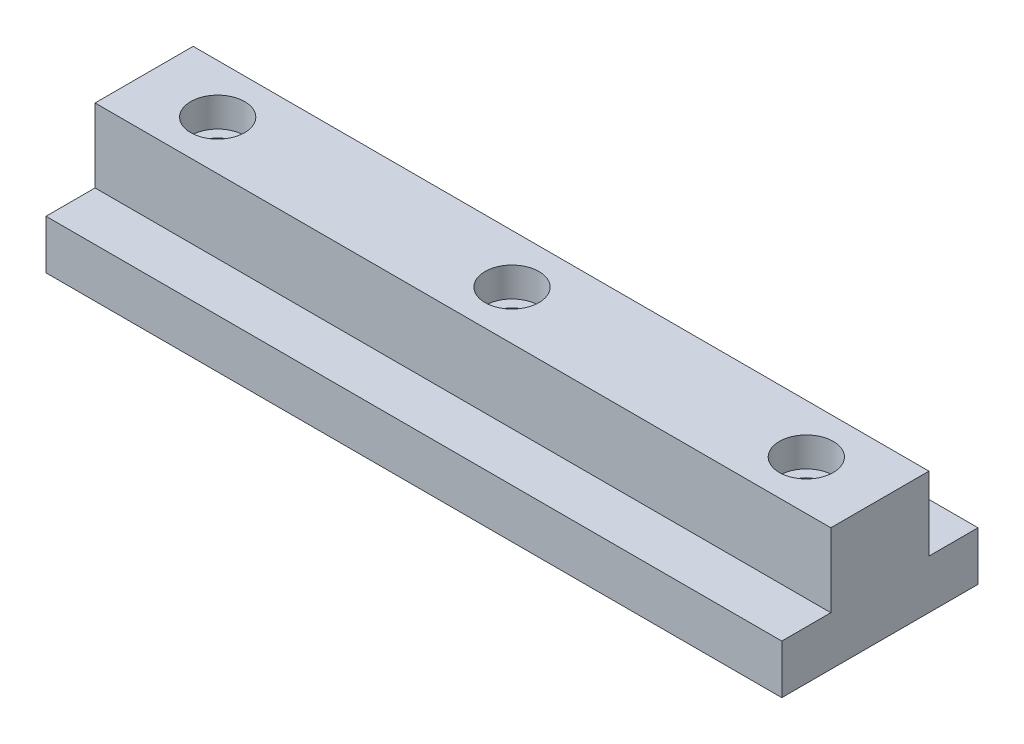
ISO-10303-21;
HEADER;
FILE_DESCRIPTION(('STEP AP214'),'2;1');
FILE_NAME('part.step','',(''),(''),'','','');
FILE_SCHEMA(('AUTOMOTIVE_DESIGN { 1 0 10303 214 1 1 1 1 }'));
ENDSEC;
DATA;
#1=APPLICATION_CONTEXT('core data for automotive mechanical design processes');
#2=APPLICATION_PROTOCOL_DEFINITION('international standard','automotive_design',2000,#1);
#3=PRODUCT_CONTEXT('',#1,'mechanical');
#4=PRODUCT('Part','Part','',(#3));
#5=PRODUCT_RELATED_PRODUCT_CATEGORY('part','',(#4));
#6=PRODUCT_DEFINITION_FORMATION('','',#4);
#7=PRODUCT_DEFINITION_CONTEXT('part definition',#1,'design');
#8=PRODUCT_DEFINITION('design','',#6,#7);
#9=PRODUCT_DEFINITION_SHAPE('','',#8);
#10=(LENGTH_UNIT() NAMED_UNIT(*) SI_UNIT(.MILLI.,.METRE.));
#11=(NAMED_UNIT(*) PLANE_ANGLE_UNIT() SI_UNIT($,.RADIAN.));
#12=(NAMED_UNIT(*) SI_UNIT($,.STERADIAN.) SOLID_ANGLE_UNIT());
#13=UNCERTAINTY_MEASURE_WITH_UNIT(LENGTH_MEASURE(1.E-05),#10,'distance_accuracy_value','');
#14=(GEOMETRIC_REPRESENTATION_CONTEXT(3) GLOBAL_UNCERTAINTY_ASSIGNED_CONTEXT((#13)) GLOBAL_UNIT_ASSIGNED_CONTEXT((#10,
#11,#12)) REPRESENTATION_CONTEXT('',''));
#15=CARTESIAN_POINT('',(0.,0.,0.));
#16=DIRECTION('',(0.,0.,1.));
#17=DIRECTION('',(1.,0.,0.));
#18=AXIS2_PLACEMENT_3D('',#15,#16,#17);
#19=CARTESIAN_POINT('',(75.,10.,-20.));
#20=DIRECTION('',(0.,0.,1.));
#21=DIRECTION('',(1.,0.,0.));
#22=AXIS2_PLACEMENT_3D('',#19,#20,#21);
#23=PLANE('',#22);
#24=DIRECTION('',(0.,1.,0.));
#25=VECTOR('',#24,1.);
#26=CARTESIAN_POINT('',(-75.,10.,-20.));
#27=LINE('',#26,#25);
#28=CARTESIAN_POINT('',(-75.,0.,-20.));
#29=VERTEX_POINT('',#28);
#30=CARTESIAN_POINT('',(-75.,10.,-20.));
#31=VERTEX_POINT('',#30);
#32=EDGE_CURVE('E157',#29,#31,#27,.T.);
#33=ORIENTED_EDGE('',*,*,#32,.T.);
#34=DIRECTION('',(-1.,0.,0.));
#35=VECTOR('',#34,1.);
#36=CARTESIAN_POINT('',(75.,10.,-20.));
#37=LINE('',#36,#35);
#38=CARTESIAN_POINT('',(75.,10.,-20.));
#39=VERTEX_POINT('',#38);
#40=EDGE_CURVE('E11',#39,#31,#37,.T.);
#41=ORIENTED_EDGE('',*,*,#40,.F.);
#42=DIRECTION('',(0.,1.,0.));
#43=VECTOR('',#42,1.);
#44=CARTESIAN_POINT('',(75.,10.,-20.));
#45=LINE('',#44,#43);
#46=CARTESIAN_POINT('',(75.,0.,-20.));
#47=VERTEX_POINT('',#46);
#48=EDGE_CURVE('E179',#47,#39,#45,.T.);
#49=ORIENTED_EDGE('',*,*,#48,.F.);
#50=DIRECTION('',(-1.,0.,0.));
#51=VECTOR('',#50,1.);
#52=CARTESIAN_POINT('',(75.,0.,-20.));
#53=LINE('',#52,#51);
#54=EDGE_CURVE('E153',#47,#29,#53,.T.);
#55=ORIENTED_EDGE('',*,*,#54,.T.);
#56=EDGE_LOOP('',(#33,#41,#49,#55));
#57=FACE_BOUND('',#56,.T.);
#58=ADVANCED_FACE('F51',(#57),#23,.F.);
#59=CARTESIAN_POINT('',(75.,10.,-10.));
#60=DIRECTION('',(0.,-1.,0.));
#61=DIRECTION('',(0.,0.,-1.));
#62=AXIS2_PLACEMENT_3D('',#59,#60,#61);
#63=PLANE('',#62);
#64=DIRECTION('',(0.,0.,1.));
#65=VECTOR('',#64,1.);
#66=CARTESIAN_POINT('',(-75.,10.,-10.));
#67=LINE('',#66,#65);
#68=CARTESIAN_POINT('',(-75.,10.,-10.));
#69=VERTEX_POINT('',#68);
#70=EDGE_CURVE('E161',#31,#69,#67,.T.);
#71=ORIENTED_EDGE('',*,*,#70,.T.);
#72=DIRECTION('',(-1.,0.,0.));
#73=VECTOR('',#72,1.);
#74=CARTESIAN_POINT('',(75.,10.,-10.));
#75=LINE('',#74,#73);
#76=CARTESIAN_POINT('',(75.,10.,-10.));
#77=VERTEX_POINT('',#76);
#78=EDGE_CURVE('E62',#77,#69,#75,.T.);
#79=ORIENTED_EDGE('',*,*,#78,.F.);
#80=DIRECTION('',(0.,0.,1.));
#81=VECTOR('',#80,1.);
#82=CARTESIAN_POINT('',(75.,10.,-10.));
#83=LINE('',#82,#81);
#84=EDGE_CURVE('E114',#39,#77,#83,.T.);
#85=ORIENTED_EDGE('',*,*,#84,.F.);
#86=ORIENTED_EDGE('',*,*,#40,.T.);
#87=EDGE_LOOP('',(#71,#79,#85,#86));
#88=FACE_BOUND('',#87,.T.);
#89=ADVANCED_FACE('F297',(#88),#63,.F.);
#90=CARTESIAN_POINT('',(75.,25.,-10.));
#91=DIRECTION('',(0.,0.,1.));
#92=DIRECTION('',(1.,0.,0.));
#93=AXIS2_PLACEMENT_3D('',#90,#91,#92);
#94=PLANE('',#93);
#95=DIRECTION('',(0.,1.,0.));
#96=VECTOR('',#95,1.);
#97=CARTESIAN_POINT('',(-75.,25.,-10.));
#98=LINE('',#97,#96);
#99=CARTESIAN_POINT('',(-75.,25.,-10.));
#100=VERTEX_POINT('',#99);
#101=EDGE_CURVE('E165',#69,#100,#98,.T.);
#102=ORIENTED_EDGE('',*,*,#101,.T.);
#103=DIRECTION('',(-1.,0.,0.));
#104=VECTOR('',#103,1.);
#105=CARTESIAN_POINT('',(75.,25.,-10.));
#106=LINE('',#105,#104);
#107=CARTESIAN_POINT('',(75.,25.,-10.));
#108=VERTEX_POINT('',#107);
#109=EDGE_CURVE('E190',#108,#100,#106,.T.);
#110=ORIENTED_EDGE('',*,*,#109,.F.);
#111=DIRECTION('',(0.,1.,0.));
#112=VECTOR('',#111,1.);
#113=CARTESIAN_POINT('',(75.,25.,-10.));
#114=LINE('',#113,#112);
#115=EDGE_CURVE('E228',#77,#108,#114,.T.);
#116=ORIENTED_EDGE('',*,*,#115,.F.);
#117=ORIENTED_EDGE('',*,*,#78,.T.);
#118=EDGE_LOOP('',(#102,#110,#116,#117));
#119=FACE_BOUND('',#118,.T.);
#120=ADVANCED_FACE('F265',(#119),#94,.F.);
#121=CARTESIAN_POINT('',(75.,25.,10.));
#122=DIRECTION('',(0.,-1.,0.));
#123=DIRECTION('',(0.,0.,-1.));
#124=AXIS2_PLACEMENT_3D('',#121,#122,#123);
#125=PLANE('',#124);
#126=CARTESIAN_POINT('',(-60.,25.,0.));
#127=DIRECTION('',(0.,1.,0.));
#128=DIRECTION('',(0.,0.,1.));
#129=AXIS2_PLACEMENT_3D('',#126,#127,#128);
#130=CIRCLE('',#129,5.5);
#131=CARTESIAN_POINT('',(-60.,25.,5.5));
#132=VERTEX_POINT('',#131);
#133=EDGE_CURVE('E235',#132,#132,#130,.T.);
#134=ORIENTED_EDGE('',*,*,#133,.F.);
#135=EDGE_LOOP('',(#134));
#136=FACE_BOUND('',#135,.T.);
#137=CARTESIAN_POINT('',(0.,25.,0.));
#138=DIRECTION('',(0.,1.,0.));
#139=DIRECTION('',(0.,0.,1.));
#140=AXIS2_PLACEMENT_3D('',#137,#138,#139);
#141=CIRCLE('',#140,5.5);
#142=CARTESIAN_POINT('',(0.,25.,5.5));
#143=VERTEX_POINT('',#142);
#144=EDGE_CURVE('E241',#143,#143,#141,.T.);
#145=ORIENTED_EDGE('',*,*,#144,.F.);
#146=EDGE_LOOP('',(#145));
#147=FACE_BOUND('',#146,.T.);
#148=CARTESIAN_POINT('',(60.,25.,0.));
#149=DIRECTION('',(0.,1.,0.));
#150=DIRECTION('',(0.,0.,1.));
#151=AXIS2_PLACEMENT_3D('',#148,#149,#150);
#152=CIRCLE('',#151,5.50000000000001);
#153=CARTESIAN_POINT('',(60.,25.,5.50000000000001));
#154=VERTEX_POINT('',#153);
#155=EDGE_CURVE('E215',#154,#154,#152,.T.);
#156=ORIENTED_EDGE('',*,*,#155,.F.);
#157=EDGE_LOOP('',(#156));
#158=FACE_BOUND('',#157,.T.);
#159=DIRECTION('',(0.,0.,1.));
#160=VECTOR('',#159,1.);
#161=CARTESIAN_POINT('',(-75.,25.,10.));
#162=LINE('',#161,#160);
#163=CARTESIAN_POINT('',(-75.,25.,10.));
#164=VERTEX_POINT('',#163);
#165=EDGE_CURVE('E168',#100,#164,#162,.T.);
#166=ORIENTED_EDGE('',*,*,#165,.T.);
#167=DIRECTION('',(-1.,0.,0.));
#168=VECTOR('',#167,1.);
#169=CARTESIAN_POINT('',(75.,25.,10.));
#170=LINE('',#169,#168);
#171=CARTESIAN_POINT('',(75.,25.,10.));
#172=VERTEX_POINT('',#171);
#173=EDGE_CURVE('E186',#172,#164,#170,.T.);
#174=ORIENTED_EDGE('',*,*,#173,.F.);
#175=DIRECTION('',(0.,0.,1.));
#176=VECTOR('',#175,1.);
#177=CARTESIAN_POINT('',(75.,25.,10.));
#178=LINE('',#177,#176);
#179=EDGE_CURVE('E231',#108,#172,#178,.T.);
#180=ORIENTED_EDGE('',*,*,#179,.F.);
#181=ORIENTED_EDGE('',*,*,#109,.T.);
#182=EDGE_LOOP('',(#166,#174,#180,#181));
#183=FACE_BOUND('',#182,.T.);
#184=ADVANCED_FACE('F261',(#136,#147,#158,#183),#125,.F.);
#185=CARTESIAN_POINT('',(75.,10.,10.));
#186=DIRECTION('',(0.,0.,-1.));
#187=DIRECTION('',(-1.,0.,0.));
#188=AXIS2_PLACEMENT_3D('',#185,#186,#187);
#189=PLANE('',#188);
#190=DIRECTION('',(0.,-1.,0.));
#191=VECTOR('',#190,1.);
#192=CARTESIAN_POINT('',(-75.,10.,10.));
#193=LINE('',#192,#191);
#194=CARTESIAN_POINT('',(-75.,10.,10.));
#195=VERTEX_POINT('',#194);
#196=EDGE_CURVE('E171',#164,#195,#193,.T.);
#197=ORIENTED_EDGE('',*,*,#196,.T.);
#198=DIRECTION('',(-1.,0.,0.));
#199=VECTOR('',#198,1.);
#200=CARTESIAN_POINT('',(75.,10.,10.));
#201=LINE('',#200,#199);
#202=CARTESIAN_POINT('',(75.,10.,10.));
#203=VERTEX_POINT('',#202);
#204=EDGE_CURVE('E144',#203,#195,#201,.T.);
#205=ORIENTED_EDGE('',*,*,#204,.F.);
#206=DIRECTION('',(0.,-1.,0.));
#207=VECTOR('',#206,1.);
#208=CARTESIAN_POINT('',(75.,10.,10.));
#209=LINE('',#208,#207);
#210=EDGE_CURVE('E133',#172,#203,#209,.T.);
#211=ORIENTED_EDGE('',*,*,#210,.F.);
#212=ORIENTED_EDGE('',*,*,#173,.T.);
#213=EDGE_LOOP('',(#197,#205,#211,#212));
#214=FACE_BOUND('',#213,.T.);
#215=ADVANCED_FACE('F264',(#214),#189,.F.);
#216=CARTESIAN_POINT('',(75.,10.,20.));
#217=DIRECTION('',(0.,-1.,0.));
#218=DIRECTION('',(0.,0.,-1.));
#219=AXIS2_PLACEMENT_3D('',#216,#217,#218);
#220=PLANE('',#219);
#221=DIRECTION('',(0.,0.,1.));
#222=VECTOR('',#221,1.);
#223=CARTESIAN_POINT('',(-75.,10.,20.));
#224=LINE('',#223,#222);
#225=CARTESIAN_POINT('',(-75.,10.,20.));
#226=VERTEX_POINT('',#225);
#227=EDGE_CURVE('E142',#195,#226,#224,.T.);
#228=ORIENTED_EDGE('',*,*,#227,.T.);
#229=DIRECTION('',(-1.,0.,0.));
#230=VECTOR('',#229,1.);
#231=CARTESIAN_POINT('',(75.,10.,20.));
#232=LINE('',#231,#230);
#233=CARTESIAN_POINT('',(75.,10.,20.));
#234=VERTEX_POINT('',#233);
#235=EDGE_CURVE('E139',#234,#226,#232,.T.);
#236=ORIENTED_EDGE('',*,*,#235,.F.);
#237=DIRECTION('',(0.,0.,1.));
#238=VECTOR('',#237,1.);
#239=CARTESIAN_POINT('',(75.,10.,20.));
#240=LINE('',#239,#238);
#241=EDGE_CURVE('E127',#203,#234,#240,.T.);
#242=ORIENTED_EDGE('',*,*,#241,.F.);
#243=ORIENTED_EDGE('',*,*,#204,.T.);
#244=EDGE_LOOP('',(#228,#236,#242,#243));
#245=FACE_BOUND('',#244,.T.);
#246=ADVANCED_FACE('F140',(#245),#220,.F.);
#247=CARTESIAN_POINT('',(75.,0.,20.));
#248=DIRECTION('',(0.,0.,-1.));
#249=DIRECTION('',(-1.,0.,0.));
#250=AXIS2_PLACEMENT_3D('',#247,#248,#249);
#251=PLANE('',#250);
#252=DIRECTION('',(0.,-1.,0.));
#253=VECTOR('',#252,1.);
#254=CARTESIAN_POINT('',(-75.,0.,20.));
#255=LINE('',#254,#253);
#256=CARTESIAN_POINT('',(-75.,0.,20.));
#257=VERTEX_POINT('',#256);
#258=EDGE_CURVE('E100',#226,#257,#255,.T.);
#259=ORIENTED_EDGE('',*,*,#258,.T.);
#260=DIRECTION('',(-1.,0.,0.));
#261=VECTOR('',#260,1.);
#262=CARTESIAN_POINT('',(75.,0.,20.));
#263=LINE('',#262,#261);
#264=CARTESIAN_POINT('',(75.,0.,20.));
#265=VERTEX_POINT('',#264);
#266=EDGE_CURVE('E145',#265,#257,#263,.T.);
#267=ORIENTED_EDGE('',*,*,#266,.F.);
#268=DIRECTION('',(0.,-1.,0.));
#269=VECTOR('',#268,1.);
#270=CARTESIAN_POINT('',(75.,0.,20.));
#271=LINE('',#270,#269);
#272=EDGE_CURVE('E131',#234,#265,#271,.T.);
#273=ORIENTED_EDGE('',*,*,#272,.F.);
#274=ORIENTED_EDGE('',*,*,#235,.T.);
#275=EDGE_LOOP('',(#259,#267,#273,#274));
#276=FACE_BOUND('',#275,.T.);
#277=ADVANCED_FACE('F147',(#276),#251,.F.);
#278=CARTESIAN_POINT('',(75.,0.,-20.));
#279=DIRECTION('',(0.,1.,0.));
#280=DIRECTION('',(0.,0.,1.));
#281=AXIS2_PLACEMENT_3D('',#278,#279,#280);
#282=PLANE('',#281);
#283=CARTESIAN_POINT('',(-60.,0.,0.));
#284=DIRECTION('',(0.,1.,0.));
#285=DIRECTION('',(0.,0.,1.));
#286=AXIS2_PLACEMENT_3D('',#283,#284,#285);
#287=CIRCLE('',#286,3.3);
#288=CARTESIAN_POINT('',(-60.,0.,3.3));
#289=VERTEX_POINT('',#288);
#290=EDGE_CURVE('E201',#289,#289,#287,.T.);
#291=ORIENTED_EDGE('',*,*,#290,.T.);
#292=EDGE_LOOP('',(#291));
#293=FACE_BOUND('',#292,.T.);
#294=CARTESIAN_POINT('',(0.,0.,0.));
#295=DIRECTION('',(0.,1.,0.));
#296=DIRECTION('',(0.,0.,1.));
#297=AXIS2_PLACEMENT_3D('',#294,#295,#296);
#298=CIRCLE('',#297,3.3);
#299=CARTESIAN_POINT('',(0.,0.,3.3));
#300=VERTEX_POINT('',#299);
#301=EDGE_CURVE('E347',#300,#300,#298,.T.);
#302=ORIENTED_EDGE('',*,*,#301,.T.);
#303=EDGE_LOOP('',(#302));
#304=FACE_BOUND('',#303,.T.);
#305=CARTESIAN_POINT('',(60.,0.,0.));
#306=DIRECTION('',(0.,1.,0.));
#307=DIRECTION('',(0.,0.,1.));
#308=AXIS2_PLACEMENT_3D('',#305,#306,#307);
#309=CIRCLE('',#308,3.3);
#310=CARTESIAN_POINT('',(60.,0.,3.3));
#311=VERTEX_POINT('',#310);
#312=EDGE_CURVE('E244',#311,#311,#309,.T.);
#313=ORIENTED_EDGE('',*,*,#312,.T.);
#314=EDGE_LOOP('',(#313));
#315=FACE_BOUND('',#314,.T.);
#316=DIRECTION('',(0.,0.,-1.));
#317=VECTOR('',#316,1.);
#318=CARTESIAN_POINT('',(-75.,0.,-20.));
#319=LINE('',#318,#317);
#320=EDGE_CURVE('E106',#257,#29,#319,.T.);
#321=ORIENTED_EDGE('',*,*,#320,.T.);
#322=ORIENTED_EDGE('',*,*,#54,.F.);
#323=DIRECTION('',(0.,0.,-1.));
#324=VECTOR('',#323,1.);
#325=CARTESIAN_POINT('',(75.,0.,-20.));
#326=LINE('',#325,#324);
#327=EDGE_CURVE('E71',#265,#47,#326,.T.);
#328=ORIENTED_EDGE('',*,*,#327,.F.);
#329=ORIENTED_EDGE('',*,*,#266,.T.);
#330=EDGE_LOOP('',(#321,#322,#328,#329));
#331=FACE_BOUND('',#330,.T.);
#332=ADVANCED_FACE('F283',(#293,#304,#315,#331),#282,.F.);
#333=CARTESIAN_POINT('',(75.,0.,0.));
#334=DIRECTION('',(-1.,0.,0.));
#335=DIRECTION('',(0.,0.,1.));
#336=AXIS2_PLACEMENT_3D('',#333,#334,#335);
#337=PLANE('',#336);
#338=ORIENTED_EDGE('',*,*,#48,.T.);
#339=ORIENTED_EDGE('',*,*,#84,.T.);
#340=ORIENTED_EDGE('',*,*,#115,.T.);
#341=ORIENTED_EDGE('',*,*,#179,.T.);
#342=ORIENTED_EDGE('',*,*,#210,.T.);
#343=ORIENTED_EDGE('',*,*,#241,.T.);
#344=ORIENTED_EDGE('',*,*,#272,.T.);
#345=ORIENTED_EDGE('',*,*,#327,.T.);
#346=EDGE_LOOP('',(#338,#339,#340,#341,#342,#343,#344,#345));
#347=FACE_BOUND('',#346,.T.);
#348=ADVANCED_FACE('F129',(#347),#337,.F.);
#349=CARTESIAN_POINT('',(-75.,0.,0.));
#350=DIRECTION('',(-1.,0.,0.));
#351=DIRECTION('',(0.,0.,1.));
#352=AXIS2_PLACEMENT_3D('',#349,#350,#351);
#353=PLANE('',#352);
#354=ORIENTED_EDGE('',*,*,#32,.F.);
#355=ORIENTED_EDGE('',*,*,#320,.F.);
#356=ORIENTED_EDGE('',*,*,#258,.F.);
#357=ORIENTED_EDGE('',*,*,#227,.F.);
#358=ORIENTED_EDGE('',*,*,#196,.F.);
#359=ORIENTED_EDGE('',*,*,#165,.F.);
#360=ORIENTED_EDGE('',*,*,#101,.F.);
#361=ORIENTED_EDGE('',*,*,#70,.F.);
#362=EDGE_LOOP('',(#354,#355,#356,#357,#358,#359,#360,#361));
#363=FACE_BOUND('',#362,.T.);
#364=ADVANCED_FACE('F279',(#363),#353,.T.);
#365=CARTESIAN_POINT('',(60.,19.,0.));
#366=DIRECTION('',(0.,1.,0.));
#367=DIRECTION('',(0.,0.,1.));
#368=AXIS2_PLACEMENT_3D('',#365,#366,#367);
#369=CYLINDRICAL_SURFACE('',#368,5.50000000000001);
#370=CARTESIAN_POINT('',(60.,19.,0.));
#371=DIRECTION('',(0.,1.,0.));
#372=DIRECTION('',(0.,0.,1.));
#373=AXIS2_PLACEMENT_3D('',#370,#371,#372);
#374=CIRCLE('',#373,5.50000000000001);
#375=CARTESIAN_POINT('',(60.,19.,5.50000000000001));
#376=VERTEX_POINT('',#375);
#377=EDGE_CURVE('E209',#376,#376,#374,.T.);
#378=ORIENTED_EDGE('',*,*,#377,.F.);
#379=EDGE_LOOP('',(#378));
#380=FACE_BOUND('',#379,.T.);
#381=ORIENTED_EDGE('',*,*,#155,.T.);
#382=EDGE_LOOP('',(#381));
#383=FACE_BOUND('',#382,.T.);
#384=ADVANCED_FACE('F320',(#380,#383),#369,.F.);
#385=CARTESIAN_POINT('',(60.,19.,0.));
#386=DIRECTION('',(0.,1.,0.));
#387=DIRECTION('',(0.,0.,1.));
#388=AXIS2_PLACEMENT_3D('',#385,#386,#387);
#389=PLANE('',#388);
#390=CARTESIAN_POINT('',(60.,19.,0.));
#391=DIRECTION('',(0.,1.,0.));
#392=DIRECTION('',(0.,0.,1.));
#393=AXIS2_PLACEMENT_3D('',#390,#391,#392);
#394=CIRCLE('',#393,3.3);
#395=CARTESIAN_POINT('',(60.,19.,3.3));
#396=VERTEX_POINT('',#395);
#397=EDGE_CURVE('E55',#396,#396,#394,.T.);
#398=ORIENTED_EDGE('',*,*,#397,.F.);
#399=EDGE_LOOP('',(#398));
#400=FACE_BOUND('',#399,.T.);
#401=ORIENTED_EDGE('',*,*,#377,.T.);
#402=EDGE_LOOP('',(#401));
#403=FACE_BOUND('',#402,.T.);
#404=ADVANCED_FACE('F257',(#400,#403),#389,.T.);
#405=CARTESIAN_POINT('',(0.,19.,0.));
#406=DIRECTION('',(0.,1.,0.));
#407=DIRECTION('',(0.,0.,1.));
#408=AXIS2_PLACEMENT_3D('',#405,#406,#407);
#409=CYLINDRICAL_SURFACE('',#408,5.5);
#410=CARTESIAN_POINT('',(0.,19.,0.));
#411=DIRECTION('',(0.,1.,0.));
#412=DIRECTION('',(0.,0.,1.));
#413=AXIS2_PLACEMENT_3D('',#410,#411,#412);
#414=CIRCLE('',#413,5.5);
#415=CARTESIAN_POINT('',(0.,19.,5.5));
#416=VERTEX_POINT('',#415);
#417=EDGE_CURVE('E221',#416,#416,#414,.T.);
#418=ORIENTED_EDGE('',*,*,#417,.F.);
#419=EDGE_LOOP('',(#418));
#420=FACE_BOUND('',#419,.T.);
#421=ORIENTED_EDGE('',*,*,#144,.T.);
#422=EDGE_LOOP('',(#421));
#423=FACE_BOUND('',#422,.T.);
#424=ADVANCED_FACE('F254',(#420,#423),#409,.F.);
#425=CARTESIAN_POINT('',(0.,19.,0.));
#426=DIRECTION('',(0.,1.,0.));
#427=DIRECTION('',(0.,0.,1.));
#428=AXIS2_PLACEMENT_3D('',#425,#426,#427);
#429=PLANE('',#428);
#430=CARTESIAN_POINT('',(0.,19.,0.));
#431=DIRECTION('',(0.,1.,0.));
#432=DIRECTION('',(0.,0.,1.));
#433=AXIS2_PLACEMENT_3D('',#430,#431,#432);
#434=CIRCLE('',#433,3.3);
#435=CARTESIAN_POINT('',(0.,19.,3.3));
#436=VERTEX_POINT('',#435);
#437=EDGE_CURVE('E200',#436,#436,#434,.T.);
#438=ORIENTED_EDGE('',*,*,#437,.F.);
#439=EDGE_LOOP('',(#438));
#440=FACE_BOUND('',#439,.T.);
#441=ORIENTED_EDGE('',*,*,#417,.T.);
#442=EDGE_LOOP('',(#441));
#443=FACE_BOUND('',#442,.T.);
#444=ADVANCED_FACE('F252',(#440,#443),#429,.T.);
#445=CARTESIAN_POINT('',(-60.,19.,0.));
#446=DIRECTION('',(0.,1.,0.));
#447=DIRECTION('',(0.,0.,1.));
#448=AXIS2_PLACEMENT_3D('',#445,#446,#447);
#449=CYLINDRICAL_SURFACE('',#448,5.5);
#450=CARTESIAN_POINT('',(-60.,19.,0.));
#451=DIRECTION('',(0.,1.,0.));
#452=DIRECTION('',(0.,0.,1.));
#453=AXIS2_PLACEMENT_3D('',#450,#451,#452);
#454=CIRCLE('',#453,5.5);
#455=CARTESIAN_POINT('',(-60.,19.,5.5));
#456=VERTEX_POINT('',#455);
#457=EDGE_CURVE('E162',#456,#456,#454,.T.);
#458=ORIENTED_EDGE('',*,*,#457,.F.);
#459=EDGE_LOOP('',(#458));
#460=FACE_BOUND('',#459,.T.);
#461=ORIENTED_EDGE('',*,*,#133,.T.);
#462=EDGE_LOOP('',(#461));
#463=FACE_BOUND('',#462,.T.);
#464=ADVANCED_FACE('F327',(#460,#463),#449,.F.);
#465=CARTESIAN_POINT('',(-60.,19.,0.));
#466=DIRECTION('',(0.,1.,0.));
#467=DIRECTION('',(0.,0.,1.));
#468=AXIS2_PLACEMENT_3D('',#465,#466,#467);
#469=PLANE('',#468);
#470=CARTESIAN_POINT('',(-60.,19.,0.));
#471=DIRECTION('',(0.,1.,0.));
#472=DIRECTION('',(0.,0.,1.));
#473=AXIS2_PLACEMENT_3D('',#470,#471,#472);
#474=CIRCLE('',#473,3.3);
#475=CARTESIAN_POINT('',(-60.,19.,3.3));
#476=VERTEX_POINT('',#475);
#477=EDGE_CURVE('E197',#476,#476,#474,.T.);
#478=ORIENTED_EDGE('',*,*,#477,.F.);
#479=EDGE_LOOP('',(#478));
#480=FACE_BOUND('',#479,.T.);
#481=ORIENTED_EDGE('',*,*,#457,.T.);
#482=EDGE_LOOP('',(#481));
#483=FACE_BOUND('',#482,.T.);
#484=ADVANCED_FACE('F330',(#480,#483),#469,.T.);
#485=CARTESIAN_POINT('',(-60.,0.,0.));
#486=DIRECTION('',(0.,1.,0.));
#487=DIRECTION('',(0.,0.,1.));
#488=AXIS2_PLACEMENT_3D('',#485,#486,#487);
#489=CYLINDRICAL_SURFACE('',#488,3.3);
#490=ORIENTED_EDGE('',*,*,#477,.T.);
#491=EDGE_LOOP('',(#490));
#492=FACE_BOUND('',#491,.T.);
#493=ORIENTED_EDGE('',*,*,#290,.F.);
#494=EDGE_LOOP('',(#493));
#495=FACE_BOUND('',#494,.T.);
#496=ADVANCED_FACE('F334',(#492,#495),#489,.F.);
#497=CARTESIAN_POINT('',(0.,0.,0.));
#498=DIRECTION('',(0.,1.,0.));
#499=DIRECTION('',(0.,0.,1.));
#500=AXIS2_PLACEMENT_3D('',#497,#498,#499);
#501=CYLINDRICAL_SURFACE('',#500,3.3);
#502=ORIENTED_EDGE('',*,*,#437,.T.);
#503=EDGE_LOOP('',(#502));
#504=FACE_BOUND('',#503,.T.);
#505=ORIENTED_EDGE('',*,*,#301,.F.);
#506=EDGE_LOOP('',(#505));
#507=FACE_BOUND('',#506,.T.);
#508=ADVANCED_FACE('F337',(#504,#507),#501,.F.);
#509=CARTESIAN_POINT('',(60.,0.,0.));
#510=DIRECTION('',(0.,1.,0.));
#511=DIRECTION('',(0.,0.,1.));
#512=AXIS2_PLACEMENT_3D('',#509,#510,#511);
#513=CYLINDRICAL_SURFACE('',#512,3.3);
#514=ORIENTED_EDGE('',*,*,#397,.T.);
#515=EDGE_LOOP('',(#514));
#516=FACE_BOUND('',#515,.T.);
#517=ORIENTED_EDGE('',*,*,#312,.F.);
#518=EDGE_LOOP('',(#517));
#519=FACE_BOUND('',#518,.T.);
#520=ADVANCED_FACE('F338',(#516,#519),#513,.F.);
#521=CLOSED_SHELL('',(#58,#89,#120,#184,#215,#246,#277,#332,#348,#364,#384,#404,#424,#444,#464,
#484,#496,#508,#520));
#522=MANIFOLD_SOLID_BREP('B2',#521);
#523=ADVANCED_BREP_SHAPE_REPRESENTATION('',(#18,#522),#14);
#524=SHAPE_DEFINITION_REPRESENTATION(#9,#523);
ENDSEC;
END-ISO-10303-21;
